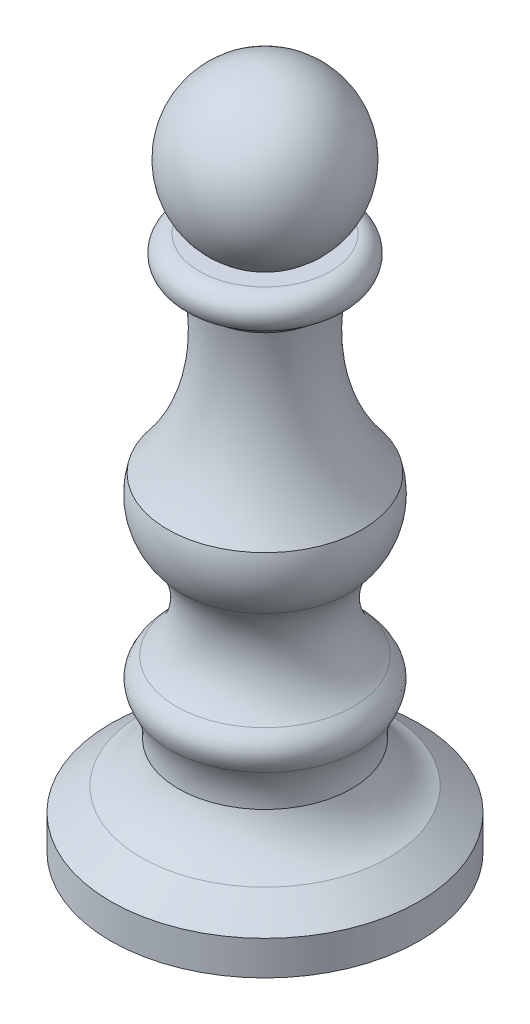
ISO-10303-21;
HEADER;
FILE_DESCRIPTION(('STEP AP214'),'2;1');
FILE_NAME('part.step','',(''),(''),'','','');
FILE_SCHEMA(('AUTOMOTIVE_DESIGN { 1 0 10303 214 1 1 1 1 }'));
ENDSEC;
DATA;
#1=APPLICATION_CONTEXT('core data for automotive mechanical design processes');
#2=APPLICATION_PROTOCOL_DEFINITION('international standard','automotive_design',2000,#1);
#3=PRODUCT_CONTEXT('',#1,'mechanical');
#4=PRODUCT('Part','Part','',(#3));
#5=PRODUCT_RELATED_PRODUCT_CATEGORY('part','',(#4));
#6=PRODUCT_DEFINITION_FORMATION('','',#4);
#7=PRODUCT_DEFINITION_CONTEXT('part definition',#1,'design');
#8=PRODUCT_DEFINITION('design','',#6,#7);
#9=PRODUCT_DEFINITION_SHAPE('','',#8);
#10=(LENGTH_UNIT() NAMED_UNIT(*) SI_UNIT(.MILLI.,.METRE.));
#11=(NAMED_UNIT(*) PLANE_ANGLE_UNIT() SI_UNIT($,.RADIAN.));
#12=(NAMED_UNIT(*) SI_UNIT($,.STERADIAN.) SOLID_ANGLE_UNIT());
#13=UNCERTAINTY_MEASURE_WITH_UNIT(LENGTH_MEASURE(1.E-05),#10,'distance_accuracy_value','');
#14=(GEOMETRIC_REPRESENTATION_CONTEXT(3) GLOBAL_UNCERTAINTY_ASSIGNED_CONTEXT((#13)) GLOBAL_UNIT_ASSIGNED_CONTEXT((#10,
#11,#12)) REPRESENTATION_CONTEXT('',''));
#15=CARTESIAN_POINT('',(0.,0.,0.));
#16=DIRECTION('',(0.,0.,1.));
#17=DIRECTION('',(1.,0.,0.));
#18=AXIS2_PLACEMENT_3D('',#15,#16,#17);
#19=CARTESIAN_POINT('',(6.83333333333332,5.,0.));
#20=CARTESIAN_POINT('',(13.2831963064283,11.7473933401987,0.));
#21=CARTESIAN_POINT('',(0.125789510665276,8.22440264716338,0.));
#22=CARTESIAN_POINT('',(7.63719221446604,20.4603609086045,0.));
#23=CARTESIAN_POINT('',(7.60467731081294,20.8702722180771,0.));
#24=B_SPLINE_CURVE_WITH_KNOTS('',3,(#19,#20,#21,#22,#23),.UNSPECIFIED.,.F.,.F.,(4,1,4),(0.,
0.888569417094027,0.922130153194439),.UNSPECIFIED.);
#25=CARTESIAN_POINT('',(0.,0.,0.));
#26=DIRECTION('',(0.,-1.,0.));
#27=AXIS1_PLACEMENT('',#25,#26);
#28=SURFACE_OF_REVOLUTION('',#24,#27);
#29=CARTESIAN_POINT('',(0.,6.90216494640454,0.));
#30=DIRECTION('',(0.,-1.,0.));
#31=DIRECTION('',(1.,0.,0.));
#32=AXIS2_PLACEMENT_3D('',#29,#30,#31);
#33=CIRCLE('',#32,8.32442966496937);
#34=CARTESIAN_POINT('',(8.32442966496937,6.90216494640454,0.));
#35=VERTEX_POINT('',#34);
#36=EDGE_CURVE('E11',#35,#35,#33,.F.);
#37=ORIENTED_EDGE('',*,*,#36,.T.);
#38=EDGE_LOOP('',(#37));
#39=FACE_BOUND('',#38,.T.);
#40=CARTESIAN_POINT('',(0.,9.89909367226707,0.));
#41=DIRECTION('',(0.,-1.,0.));
#42=DIRECTION('',(1.,0.,0.));
#43=AXIS2_PLACEMENT_3D('',#40,#41,#42);
#44=CIRCLE('',#43,7.75374464056633);
#45=CARTESIAN_POINT('',(7.75374464056633,9.89909367226707,0.));
#46=VERTEX_POINT('',#45);
#47=EDGE_CURVE('E54',#46,#46,#44,.T.);
#48=ORIENTED_EDGE('',*,*,#47,.T.);
#49=EDGE_LOOP('',(#48));
#50=FACE_BOUND('',#49,.T.);
#51=ADVANCED_FACE('F39',(#39,#50),#28,.F.);
#52=CARTESIAN_POINT('',(0.,14.2992990234489,0.));
#53=DIRECTION('',(0.,-1.,0.));
#54=DIRECTION('',(1.,0.,0.));
#55=AXIS2_PLACEMENT_3D('',#52,#53,#54);
#56=TOROIDAL_SURFACE('',#55,11.8327387405168,6.);
#57=CARTESIAN_POINT('',(0.,18.2176145725045,0.));
#58=DIRECTION('',(0.,-1.,0.));
#59=DIRECTION('',(1.,0.,0.));
#60=AXIS2_PLACEMENT_3D('',#57,#58,#59);
#61=CIRCLE('',#60,7.28886338372831);
#62=CARTESIAN_POINT('',(7.28886338372831,18.2176145725045,0.));
#63=VERTEX_POINT('',#62);
#64=EDGE_CURVE('E46',#63,#63,#61,.T.);
#65=ORIENTED_EDGE('',*,*,#64,.T.);
#66=EDGE_LOOP('',(#65));
#67=FACE_BOUND('',#66,.T.);
#68=ORIENTED_EDGE('',*,*,#47,.F.);
#69=EDGE_LOOP('',(#68));
#70=FACE_BOUND('',#69,.T.);
#71=ADVANCED_FACE('F77',(#67,#70),#56,.F.);
#72=CARTESIAN_POINT('',(0.,0.,0.));
#73=DIRECTION('',(0.,-1.,0.));
#74=DIRECTION('',(0.,0.,-1.));
#75=AXIS2_PLACEMENT_3D('',#72,#73,#74);
#76=CONICAL_SURFACE('',#75,10.8333333333333,0.925024503556996);
#77=CARTESIAN_POINT('',(0.,-2.,0.));
#78=DIRECTION('',(0.,-1.,0.));
#79=DIRECTION('',(0.,0.,-1.));
#80=AXIS2_PLACEMENT_3D('',#77,#78,#79);
#81=CIRCLE('',#80,13.4874229765742);
#82=CARTESIAN_POINT('',(0.,-2.,-13.4874229765742));
#83=VERTEX_POINT('',#82);
#84=EDGE_CURVE('E64',#83,#83,#81,.T.);
#85=ORIENTED_EDGE('',*,*,#84,.F.);
#86=EDGE_LOOP('',(#85));
#87=FACE_BOUND('',#86,.T.);
#88=CARTESIAN_POINT('',(0.,0.,0.));
#89=DIRECTION('',(0.,-1.,0.));
#90=DIRECTION('',(0.,0.,-1.));
#91=AXIS2_PLACEMENT_3D('',#88,#89,#90);
#92=CIRCLE('',#91,10.8333333333333);
#93=CARTESIAN_POINT('',(0.,0.,-10.8333333333333));
#94=VERTEX_POINT('',#93);
#95=EDGE_CURVE('E104',#94,#94,#92,.T.);
#96=ORIENTED_EDGE('',*,*,#95,.T.);
#97=EDGE_LOOP('',(#96));
#98=FACE_BOUND('',#97,.T.);
#99=ADVANCED_FACE('F82',(#87,#98),#76,.T.);
#100=CARTESIAN_POINT('',(0.,5.48431364168173,0.));
#101=DIRECTION('',(0.,-1.,0.));
#102=DIRECTION('',(1.,0.,0.));
#103=AXIS2_PLACEMENT_3D('',#100,#101,#102);
#104=TOROIDAL_SURFACE('',#103,13.2669117437538,6.);
#105=ORIENTED_EDGE('',*,*,#95,.F.);
#106=EDGE_LOOP('',(#105));
#107=FACE_BOUND('',#106,.T.);
#108=CARTESIAN_POINT('',(0.,3.58377892803714,0.));
#109=DIRECTION('',(0.,-1.,0.));
#110=DIRECTION('',(1.,0.,0.));
#111=AXIS2_PLACEMENT_3D('',#108,#109,#110);
#112=CIRCLE('',#111,7.57586897443351);
#113=CARTESIAN_POINT('',(7.57586897443351,3.58377892803714,0.));
#114=VERTEX_POINT('',#113);
#115=EDGE_CURVE('E50',#114,#114,#112,.F.);
#116=ORIENTED_EDGE('',*,*,#115,.F.);
#117=EDGE_LOOP('',(#116));
#118=FACE_BOUND('',#117,.T.);
#119=ADVANCED_FACE('F83',(#107,#118),#104,.F.);
#120=CARTESIAN_POINT('',(0.,22.1359301215601,0.));
#121=DIRECTION('',(0.,-1.,0.));
#122=DIRECTION('',(1.,0.,0.));
#123=AXIS2_PLACEMENT_3D('',#120,#121,#122);
#124=DEGENERATE_TOROIDAL_SURFACE('',#123,2.74498802693985,6.,.T.);
#125=ORIENTED_EDGE('',*,*,#64,.F.);
#126=EDGE_LOOP('',(#125));
#127=FACE_BOUND('',#126,.T.);
#128=CARTESIAN_POINT('',(0.,23.7112932395781,0.));
#129=DIRECTION('',(0.,-1.,0.));
#130=DIRECTION('',(0.,0.,-1.));
#131=AXIS2_PLACEMENT_3D('',#128,#129,#130);
#132=CIRCLE('',#131,8.53448118665501);
#133=CARTESIAN_POINT('',(0.,23.7112932395781,-8.53448118665501));
#134=VERTEX_POINT('',#133);
#135=EDGE_CURVE('E99',#134,#134,#132,.T.);
#136=ORIENTED_EDGE('',*,*,#135,.T.);
#137=EDGE_LOOP('',(#136));
#138=FACE_BOUND('',#137,.T.);
#139=ADVANCED_FACE('F85',(#127,#138),#124,.T.);
#140=CARTESIAN_POINT('',(5.,37.8702722180771,0.));
#141=CARTESIAN_POINT('',(3.75108051327851,29.6166226293214,0.));
#142=CARTESIAN_POINT('',(8.53448118665501,23.7112932395781,0.));
#143=B_SPLINE_CURVE_WITH_KNOTS('',2,(#140,#141,#142),.UNSPECIFIED.,.F.,.F.,(3,3),(0.,
0.759883207088287),.UNSPECIFIED.);
#144=CARTESIAN_POINT('',(0.,0.,0.));
#145=DIRECTION('',(0.,-1.,0.));
#146=AXIS1_PLACEMENT('',#144,#145);
#147=SURFACE_OF_REVOLUTION('',#143,#146);
#148=ORIENTED_EDGE('',*,*,#135,.F.);
#149=EDGE_LOOP('',(#148));
#150=FACE_BOUND('',#149,.T.);
#151=CARTESIAN_POINT('',(0.,37.8702722180771,0.));
#152=DIRECTION('',(0.,-1.,0.));
#153=DIRECTION('',(0.,0.,-1.));
#154=AXIS2_PLACEMENT_3D('',#151,#152,#153);
#155=CIRCLE('',#154,5.);
#156=CARTESIAN_POINT('',(0.,37.8702722180771,-5.));
#157=VERTEX_POINT('',#156);
#158=EDGE_CURVE('E100',#157,#157,#155,.T.);
#159=ORIENTED_EDGE('',*,*,#158,.T.);
#160=EDGE_LOOP('',(#159));
#161=FACE_BOUND('',#160,.T.);
#162=ADVANCED_FACE('F88',(#150,#161),#147,.T.);
#163=CARTESIAN_POINT('',(0.,47.4958641933845,0.));
#164=DIRECTION('',(0.,1.,0.));
#165=DIRECTION('',(0.,0.,-1.));
#166=AXIS2_PLACEMENT_3D('',#163,#164,#165);
#167=SPHERICAL_SURFACE('',#166,7.);
#168=CARTESIAN_POINT('',(0.,41.8702722180771,0.));
#169=DIRECTION('',(0.,1.,0.));
#170=DIRECTION('',(0.,0.,1.));
#171=AXIS2_PLACEMENT_3D('',#168,#169,#170);
#172=CIRCLE('',#171,4.16565900276988);
#173=CARTESIAN_POINT('',(0.,41.8702722180771,4.16565900276988));
#174=VERTEX_POINT('',#173);
#175=EDGE_CURVE('E60',#174,#174,#172,.F.);
#176=ORIENTED_EDGE('',*,*,#175,.F.);
#177=EDGE_LOOP('',(#176));
#178=FACE_BOUND('',#177,.T.);
#179=ADVANCED_FACE('F93',(#178),#167,.T.);
#180=CARTESIAN_POINT('',(0.,41.8702722180771,-5.7535540501028));
#181=DIRECTION('',(0.,1.,0.));
#182=DIRECTION('',(0.,0.,1.));
#183=AXIS2_PLACEMENT_3D('',#180,#181,#182);
#184=PLANE('',#183);
#185=ORIENTED_EDGE('',*,*,#175,.T.);
#186=EDGE_LOOP('',(#185));
#187=FACE_BOUND('',#186,.T.);
#188=CARTESIAN_POINT('',(0.,41.8702722180771,0.));
#189=DIRECTION('',(0.,-1.,0.));
#190=DIRECTION('',(0.,0.,-1.));
#191=AXIS2_PLACEMENT_3D('',#188,#189,#190);
#192=CIRCLE('',#191,5.7535540501028);
#193=CARTESIAN_POINT('',(0.,41.8702722180771,-5.7535540501028));
#194=VERTEX_POINT('',#193);
#195=EDGE_CURVE('E63',#194,#194,#192,.T.);
#196=ORIENTED_EDGE('',*,*,#195,.F.);
#197=EDGE_LOOP('',(#196));
#198=FACE_BOUND('',#197,.T.);
#199=ADVANCED_FACE('F134',(#187,#198),#184,.T.);
#200=CARTESIAN_POINT('',(0.,40.3702722180771,0.));
#201=DIRECTION('',(0.,-1.,0.));
#202=DIRECTION('',(0.,0.,-1.));
#203=AXIS2_PLACEMENT_3D('',#200,#201,#202);
#204=TOROIDAL_SURFACE('',#203,5.7535540501028,1.5);
#205=ORIENTED_EDGE('',*,*,#195,.T.);
#206=EDGE_LOOP('',(#205));
#207=FACE_BOUND('',#206,.T.);
#208=CARTESIAN_POINT('',(0.,38.8702722180771,0.));
#209=DIRECTION('',(0.,1.,0.));
#210=DIRECTION('',(-1.,0.,0.));
#211=AXIS2_PLACEMENT_3D('',#208,#209,#210);
#212=CIRCLE('',#211,5.7535540501028);
#213=CARTESIAN_POINT('',(-5.75355405010279,38.8702722180771,0.));
#214=VERTEX_POINT('',#213);
#215=EDGE_CURVE('E59',#214,#214,#212,.T.);
#216=ORIENTED_EDGE('',*,*,#215,.T.);
#217=EDGE_LOOP('',(#216));
#218=FACE_BOUND('',#217,.T.);
#219=ADVANCED_FACE('F122',(#207,#218),#204,.T.);
#220=CARTESIAN_POINT('',(0.,37.8702722180771,0.));
#221=DIRECTION('',(0.,1.,0.));
#222=DIRECTION('',(-1.,0.,0.));
#223=AXIS2_PLACEMENT_3D('',#220,#221,#222);
#224=CONICAL_SURFACE('',#223,5.,0.645771823237902);
#225=ORIENTED_EDGE('',*,*,#215,.F.);
#226=EDGE_LOOP('',(#225));
#227=FACE_BOUND('',#226,.T.);
#228=ORIENTED_EDGE('',*,*,#158,.F.);
#229=EDGE_LOOP('',(#228));
#230=FACE_BOUND('',#229,.T.);
#231=ADVANCED_FACE('F78',(#227,#230),#224,.T.);
#232=CARTESIAN_POINT('',(0.,3.97683076937096,0.));
#233=DIRECTION('',(0.,-1.,0.));
#234=DIRECTION('',(1.,0.,0.));
#235=AXIS2_PLACEMENT_3D('',#232,#233,#234);
#236=TOROIDAL_SURFACE('',#235,13.562980986917,6.);
#237=ORIENTED_EDGE('',*,*,#115,.T.);
#238=EDGE_LOOP('',(#237));
#239=FACE_BOUND('',#238,.T.);
#240=ORIENTED_EDGE('',*,*,#36,.F.);
#241=EDGE_LOOP('',(#240));
#242=FACE_BOUND('',#241,.T.);
#243=ADVANCED_FACE('F41',(#239,#242),#236,.F.);
#244=CARTESIAN_POINT('',(0.,-5.,0.));
#245=DIRECTION('',(0.,1.,0.));
#246=DIRECTION('',(0.,0.,1.));
#247=AXIS2_PLACEMENT_3D('',#244,#245,#246);
#248=CYLINDRICAL_SURFACE('',#247,13.4874229765742);
#249=CARTESIAN_POINT('',(0.,-5.,0.));
#250=DIRECTION('',(0.,-1.,0.));
#251=DIRECTION('',(0.,0.,-1.));
#252=AXIS2_PLACEMENT_3D('',#249,#250,#251);
#253=CIRCLE('',#252,13.4874229765742);
#254=CARTESIAN_POINT('',(0.,-5.,-13.4874229765742));
#255=VERTEX_POINT('',#254);
#256=EDGE_CURVE('E101',#255,#255,#253,.T.);
#257=ORIENTED_EDGE('',*,*,#256,.F.);
#258=EDGE_LOOP('',(#257));
#259=FACE_BOUND('',#258,.T.);
#260=ORIENTED_EDGE('',*,*,#84,.T.);
#261=EDGE_LOOP('',(#260));
#262=FACE_BOUND('',#261,.T.);
#263=ADVANCED_FACE('F132',(#259,#262),#248,.T.);
#264=CARTESIAN_POINT('',(0.,-5.,0.));
#265=DIRECTION('',(0.,-1.,0.));
#266=DIRECTION('',(0.,0.,-1.));
#267=AXIS2_PLACEMENT_3D('',#264,#265,#266);
#268=PLANE('',#267);
#269=ORIENTED_EDGE('',*,*,#256,.T.);
#270=EDGE_LOOP('',(#269));
#271=FACE_BOUND('',#270,.T.);
#272=ADVANCED_FACE('F149',(#271),#268,.T.);
#273=CLOSED_SHELL('',(#51,#71,#99,#119,#139,#162,#179,#199,#219,#231,#243,#263,#272));
#274=MANIFOLD_SOLID_BREP('B2',#273);
#275=ADVANCED_BREP_SHAPE_REPRESENTATION('',(#18,#274),#14);
#276=SHAPE_DEFINITION_REPRESENTATION(#9,#275);
ENDSEC;
END-ISO-10303-21;
